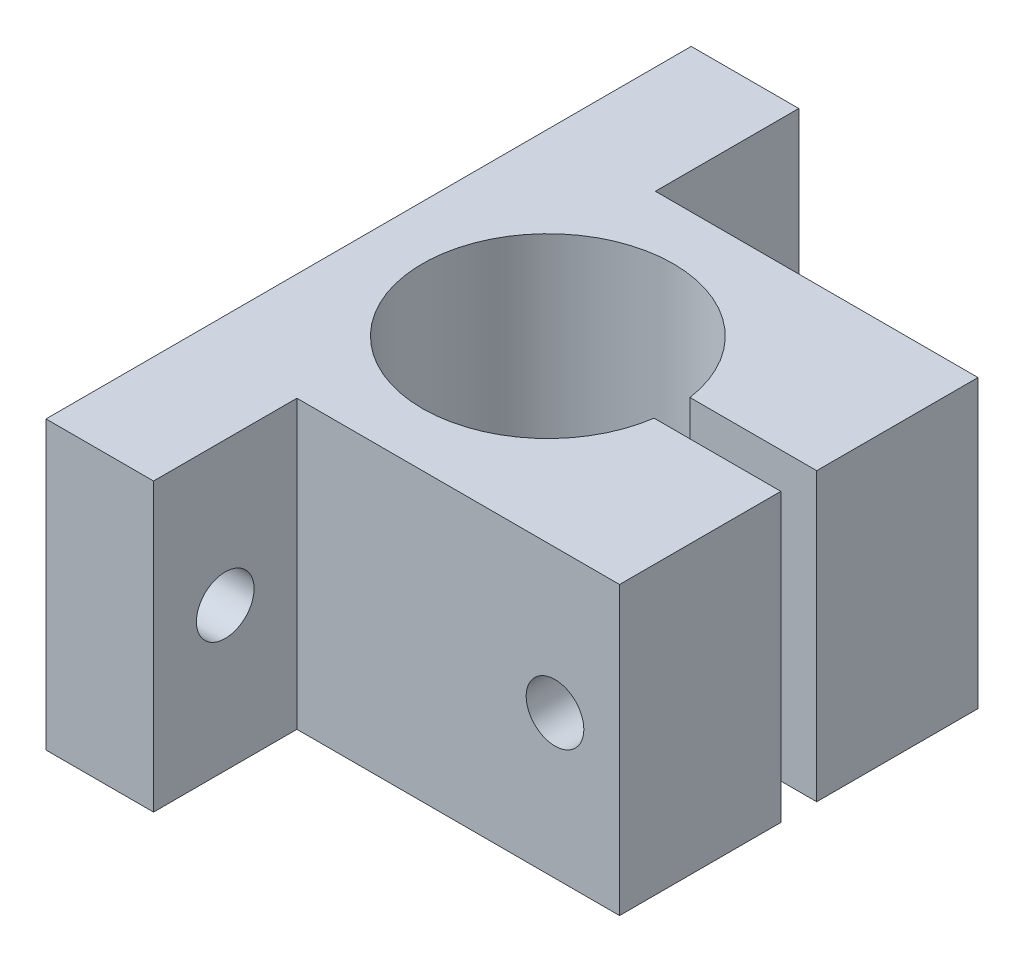
ISO-10303-21;
HEADER;
FILE_DESCRIPTION(('STEP AP214'),'2;1');
FILE_NAME('part.step','',(''),(''),'','','');
FILE_SCHEMA(('AUTOMOTIVE_DESIGN { 1 0 10303 214 1 1 1 1 }'));
ENDSEC;
DATA;
#1=APPLICATION_CONTEXT('core data for automotive mechanical design processes');
#2=APPLICATION_PROTOCOL_DEFINITION('international standard','automotive_design',2000,#1);
#3=PRODUCT_CONTEXT('',#1,'mechanical');
#4=PRODUCT('Part','Part','',(#3));
#5=PRODUCT_RELATED_PRODUCT_CATEGORY('part','',(#4));
#6=PRODUCT_DEFINITION_FORMATION('','',#4);
#7=PRODUCT_DEFINITION_CONTEXT('part definition',#1,'design');
#8=PRODUCT_DEFINITION('design','',#6,#7);
#9=PRODUCT_DEFINITION_SHAPE('','',#8);
#10=(LENGTH_UNIT() NAMED_UNIT(*) SI_UNIT(.MILLI.,.METRE.));
#11=(NAMED_UNIT(*) PLANE_ANGLE_UNIT() SI_UNIT($,.RADIAN.));
#12=(NAMED_UNIT(*) SI_UNIT($,.STERADIAN.) SOLID_ANGLE_UNIT());
#13=UNCERTAINTY_MEASURE_WITH_UNIT(LENGTH_MEASURE(1.E-05),#10,'distance_accuracy_value','');
#14=(GEOMETRIC_REPRESENTATION_CONTEXT(3) GLOBAL_UNCERTAINTY_ASSIGNED_CONTEXT((#13)) GLOBAL_UNIT_ASSIGNED_CONTEXT((#10,
#11,#12)) REPRESENTATION_CONTEXT('',''));
#15=CARTESIAN_POINT('',(0.,0.,0.));
#16=DIRECTION('',(0.,0.,1.));
#17=DIRECTION('',(1.,0.,0.));
#18=AXIS2_PLACEMENT_3D('',#15,#16,#17);
#19=CARTESIAN_POINT('',(12.7,-12.7,-28.575));
#20=DIRECTION('',(-1.,0.,0.));
#21=DIRECTION('',(0.,0.,1.));
#22=AXIS2_PLACEMENT_3D('',#19,#20,#21);
#23=PLANE('',#22);
#24=DIRECTION('',(0.,0.,1.));
#25=VECTOR('',#24,1.);
#26=CARTESIAN_POINT('',(12.7,-12.7,-28.575));
#27=LINE('',#26,#25);
#28=CARTESIAN_POINT('',(12.7,-12.7,1.5875));
#29=VERTEX_POINT('',#28);
#30=CARTESIAN_POINT('',(12.7,-12.7,15.875));
#31=VERTEX_POINT('',#30);
#32=EDGE_CURVE('E144',#29,#31,#27,.T.);
#33=ORIENTED_EDGE('',*,*,#32,.F.);
#34=DIRECTION('',(0.,1.,0.));
#35=VECTOR('',#34,1.);
#36=CARTESIAN_POINT('',(12.7,-12.7,1.5875));
#37=LINE('',#36,#35);
#38=CARTESIAN_POINT('',(12.7,12.7,1.5875));
#39=VERTEX_POINT('',#38);
#40=EDGE_CURVE('E11',#29,#39,#37,.T.);
#41=ORIENTED_EDGE('',*,*,#40,.T.);
#42=DIRECTION('',(0.,0.,1.));
#43=VECTOR('',#42,1.);
#44=CARTESIAN_POINT('',(12.7,12.7,-28.575));
#45=LINE('',#44,#43);
#46=CARTESIAN_POINT('',(12.7,12.7,15.875));
#47=VERTEX_POINT('',#46);
#48=EDGE_CURVE('E145',#39,#47,#45,.T.);
#49=ORIENTED_EDGE('',*,*,#48,.T.);
#50=DIRECTION('',(0.,1.,0.));
#51=VECTOR('',#50,1.);
#52=CARTESIAN_POINT('',(12.7,-12.7,15.875));
#53=LINE('',#52,#51);
#54=EDGE_CURVE('E218',#31,#47,#53,.T.);
#55=ORIENTED_EDGE('',*,*,#54,.F.);
#56=EDGE_LOOP('',(#33,#41,#49,#55));
#57=FACE_BOUND('',#56,.T.);
#58=ADVANCED_FACE('F35',(#57),#23,.F.);
#59=CARTESIAN_POINT('',(-25.4,12.7,-28.575));
#60=DIRECTION('',(0.,0.,1.));
#61=DIRECTION('',(1.,0.,0.));
#62=AXIS2_PLACEMENT_3D('',#59,#60,#61);
#63=PLANE('',#62);
#64=DIRECTION('',(-1.,0.,0.));
#65=VECTOR('',#64,1.);
#66=CARTESIAN_POINT('',(-25.4,12.7,-28.575));
#67=LINE('',#66,#65);
#68=CARTESIAN_POINT('',(-15.875,12.7,-28.575));
#69=VERTEX_POINT('',#68);
#70=CARTESIAN_POINT('',(-25.4,12.7,-28.575));
#71=VERTEX_POINT('',#70);
#72=EDGE_CURVE('E156',#69,#71,#67,.T.);
#73=ORIENTED_EDGE('',*,*,#72,.F.);
#74=DIRECTION('',(0.,1.,0.));
#75=VECTOR('',#74,1.);
#76=CARTESIAN_POINT('',(-15.875,-12.7,-28.575));
#77=LINE('',#76,#75);
#78=CARTESIAN_POINT('',(-15.875,-12.7,-28.575));
#79=VERTEX_POINT('',#78);
#80=EDGE_CURVE('E202',#79,#69,#77,.T.);
#81=ORIENTED_EDGE('',*,*,#80,.F.);
#82=DIRECTION('',(-1.,0.,0.));
#83=VECTOR('',#82,1.);
#84=CARTESIAN_POINT('',(-25.4,-12.7,-28.575));
#85=LINE('',#84,#83);
#86=CARTESIAN_POINT('',(-25.4,-12.7,-28.575));
#87=VERTEX_POINT('',#86);
#88=EDGE_CURVE('E154',#79,#87,#85,.T.);
#89=ORIENTED_EDGE('',*,*,#88,.T.);
#90=DIRECTION('',(0.,-1.,0.));
#91=VECTOR('',#90,1.);
#92=CARTESIAN_POINT('',(-25.4,12.7,-28.575));
#93=LINE('',#92,#91);
#94=EDGE_CURVE('E129',#71,#87,#93,.T.);
#95=ORIENTED_EDGE('',*,*,#94,.F.);
#96=EDGE_LOOP('',(#73,#81,#89,#95));
#97=FACE_BOUND('',#96,.T.);
#98=ADVANCED_FACE('F37',(#97),#63,.F.);
#99=CARTESIAN_POINT('',(-25.4,12.7,-28.575));
#100=DIRECTION('',(1.,0.,0.));
#101=DIRECTION('',(0.,0.,-1.));
#102=AXIS2_PLACEMENT_3D('',#99,#100,#101);
#103=PLANE('',#102);
#104=CARTESIAN_POINT('',(-25.4,0.,-22.225));
#105=DIRECTION('',(1.,0.,0.));
#106=DIRECTION('',(0.,0.,-1.));
#107=AXIS2_PLACEMENT_3D('',#104,#105,#106);
#108=CIRCLE('',#107,2.55269999999999);
#109=CARTESIAN_POINT('',(-25.4,0.,-24.7777));
#110=VERTEX_POINT('',#109);
#111=EDGE_CURVE('E235',#110,#110,#108,.T.);
#112=ORIENTED_EDGE('',*,*,#111,.T.);
#113=EDGE_LOOP('',(#112));
#114=FACE_BOUND('',#113,.T.);
#115=CARTESIAN_POINT('',(-25.4,0.,22.225));
#116=DIRECTION('',(1.,0.,0.));
#117=DIRECTION('',(0.,0.,-1.));
#118=AXIS2_PLACEMENT_3D('',#115,#116,#117);
#119=CIRCLE('',#118,2.55269999999999);
#120=CARTESIAN_POINT('',(-25.4,0.,19.6723));
#121=VERTEX_POINT('',#120);
#122=EDGE_CURVE('E227',#121,#121,#119,.T.);
#123=ORIENTED_EDGE('',*,*,#122,.T.);
#124=EDGE_LOOP('',(#123));
#125=FACE_BOUND('',#124,.T.);
#126=DIRECTION('',(0.,0.,1.));
#127=VECTOR('',#126,1.);
#128=CARTESIAN_POINT('',(-25.4,-12.7,-28.575));
#129=LINE('',#128,#127);
#130=CARTESIAN_POINT('',(-25.4,-12.7,28.575));
#131=VERTEX_POINT('',#130);
#132=EDGE_CURVE('E166',#87,#131,#129,.T.);
#133=ORIENTED_EDGE('',*,*,#132,.T.);
#134=DIRECTION('',(0.,-1.,0.));
#135=VECTOR('',#134,1.);
#136=CARTESIAN_POINT('',(-25.4,12.7,28.575));
#137=LINE('',#136,#135);
#138=CARTESIAN_POINT('',(-25.4,12.7,28.575));
#139=VERTEX_POINT('',#138);
#140=EDGE_CURVE('E164',#139,#131,#137,.T.);
#141=ORIENTED_EDGE('',*,*,#140,.F.);
#142=DIRECTION('',(0.,0.,1.));
#143=VECTOR('',#142,1.);
#144=CARTESIAN_POINT('',(-25.4,12.7,-28.575));
#145=LINE('',#144,#143);
#146=EDGE_CURVE('E158',#71,#139,#145,.T.);
#147=ORIENTED_EDGE('',*,*,#146,.F.);
#148=ORIENTED_EDGE('',*,*,#94,.T.);
#149=EDGE_LOOP('',(#133,#141,#147,#148));
#150=FACE_BOUND('',#149,.T.);
#151=ADVANCED_FACE('F177',(#114,#125,#150),#103,.F.);
#152=CARTESIAN_POINT('',(-25.4,12.7,28.575));
#153=DIRECTION('',(0.,0.,-1.));
#154=DIRECTION('',(-1.,0.,0.));
#155=AXIS2_PLACEMENT_3D('',#152,#153,#154);
#156=PLANE('',#155);
#157=DIRECTION('',(1.,0.,0.));
#158=VECTOR('',#157,1.);
#159=CARTESIAN_POINT('',(-25.4,-12.7,28.575));
#160=LINE('',#159,#158);
#161=CARTESIAN_POINT('',(-15.875,-12.7,28.575));
#162=VERTEX_POINT('',#161);
#163=EDGE_CURVE('E159',#131,#162,#160,.T.);
#164=ORIENTED_EDGE('',*,*,#163,.T.);
#165=DIRECTION('',(0.,1.,0.));
#166=VECTOR('',#165,1.);
#167=CARTESIAN_POINT('',(-15.875,-12.7,28.575));
#168=LINE('',#167,#166);
#169=CARTESIAN_POINT('',(-15.875,12.7,28.575));
#170=VERTEX_POINT('',#169);
#171=EDGE_CURVE('E194',#162,#170,#168,.T.);
#172=ORIENTED_EDGE('',*,*,#171,.T.);
#173=DIRECTION('',(1.,0.,0.));
#174=VECTOR('',#173,1.);
#175=CARTESIAN_POINT('',(-25.4,12.7,28.575));
#176=LINE('',#175,#174);
#177=EDGE_CURVE('E161',#139,#170,#176,.T.);
#178=ORIENTED_EDGE('',*,*,#177,.F.);
#179=ORIENTED_EDGE('',*,*,#140,.T.);
#180=EDGE_LOOP('',(#164,#172,#178,#179));
#181=FACE_BOUND('',#180,.T.);
#182=ADVANCED_FACE('F192',(#181),#156,.F.);
#183=CARTESIAN_POINT('',(0.,12.7,0.));
#184=DIRECTION('',(0.,1.,0.));
#185=DIRECTION('',(0.,0.,1.));
#186=AXIS2_PLACEMENT_3D('',#183,#184,#185);
#187=PLANE('',#186);
#188=DIRECTION('',(1.,0.,0.));
#189=VECTOR('',#188,1.);
#190=CARTESIAN_POINT('',(0.,12.7,1.5875));
#191=LINE('',#190,#189);
#192=CARTESIAN_POINT('',(1.47352262806235,12.7,1.5875));
#193=VERTEX_POINT('',#192);
#194=EDGE_CURVE('E59',#193,#39,#191,.T.);
#195=ORIENTED_EDGE('',*,*,#194,.F.);
#196=CARTESIAN_POINT('',(-9.52500000000002,12.7,0.));
#197=DIRECTION('',(0.,1.,0.));
#198=DIRECTION('',(0.,0.,1.));
#199=AXIS2_PLACEMENT_3D('',#196,#197,#198);
#200=CIRCLE('',#199,11.1125);
#201=CARTESIAN_POINT('',(1.47352262806235,12.7,-1.5875));
#202=VERTEX_POINT('',#201);
#203=EDGE_CURVE('E138',#202,#193,#200,.T.);
#204=ORIENTED_EDGE('',*,*,#203,.F.);
#205=DIRECTION('',(-1.,0.,0.));
#206=VECTOR('',#205,1.);
#207=CARTESIAN_POINT('',(0.,12.7,-1.5875));
#208=LINE('',#207,#206);
#209=CARTESIAN_POINT('',(12.7,12.7,-1.5875));
#210=VERTEX_POINT('',#209);
#211=EDGE_CURVE('E123',#210,#202,#208,.T.);
#212=ORIENTED_EDGE('',*,*,#211,.F.);
#213=CARTESIAN_POINT('',(12.7,12.7,-15.875));
#214=VERTEX_POINT('',#213);
#215=EDGE_CURVE('E136',#214,#210,#45,.T.);
#216=ORIENTED_EDGE('',*,*,#215,.F.);
#217=DIRECTION('',(1.,0.,0.));
#218=VECTOR('',#217,1.);
#219=CARTESIAN_POINT('',(12.7,12.7,-15.875));
#220=LINE('',#219,#218);
#221=CARTESIAN_POINT('',(-15.875,12.7,-15.875));
#222=VERTEX_POINT('',#221);
#223=EDGE_CURVE('E212',#222,#214,#220,.T.);
#224=ORIENTED_EDGE('',*,*,#223,.F.);
#225=DIRECTION('',(0.,0.,1.));
#226=VECTOR('',#225,1.);
#227=CARTESIAN_POINT('',(-15.875,12.7,-28.575));
#228=LINE('',#227,#226);
#229=EDGE_CURVE('E200',#69,#222,#228,.T.);
#230=ORIENTED_EDGE('',*,*,#229,.F.);
#231=ORIENTED_EDGE('',*,*,#72,.T.);
#232=ORIENTED_EDGE('',*,*,#146,.T.);
#233=ORIENTED_EDGE('',*,*,#177,.T.);
#234=DIRECTION('',(0.,0.,1.));
#235=VECTOR('',#234,1.);
#236=CARTESIAN_POINT('',(-15.875,12.7,28.575));
#237=LINE('',#236,#235);
#238=CARTESIAN_POINT('',(-15.875,12.7,15.875));
#239=VERTEX_POINT('',#238);
#240=EDGE_CURVE('E197',#239,#170,#237,.T.);
#241=ORIENTED_EDGE('',*,*,#240,.F.);
#242=DIRECTION('',(-1.,0.,0.));
#243=VECTOR('',#242,1.);
#244=CARTESIAN_POINT('',(-15.875,12.7,15.875));
#245=LINE('',#244,#243);
#246=EDGE_CURVE('E223',#47,#239,#245,.T.);
#247=ORIENTED_EDGE('',*,*,#246,.F.);
#248=ORIENTED_EDGE('',*,*,#48,.F.);
#249=EDGE_LOOP('',(#195,#204,#212,#216,#224,#230,#231,#232,#233,#241,#247,#248));
#250=FACE_BOUND('',#249,.T.);
#251=ADVANCED_FACE('F134',(#250),#187,.T.);
#252=CARTESIAN_POINT('',(0.,-12.7,0.));
#253=DIRECTION('',(0.,1.,0.));
#254=DIRECTION('',(0.,0.,1.));
#255=AXIS2_PLACEMENT_3D('',#252,#253,#254);
#256=PLANE('',#255);
#257=CARTESIAN_POINT('',(-9.52500000000002,-12.7,0.));
#258=DIRECTION('',(0.,1.,0.));
#259=DIRECTION('',(0.,0.,1.));
#260=AXIS2_PLACEMENT_3D('',#257,#258,#259);
#261=CIRCLE('',#260,11.1125);
#262=CARTESIAN_POINT('',(1.47352262806235,-12.7,-1.5875));
#263=VERTEX_POINT('',#262);
#264=CARTESIAN_POINT('',(1.47352262806235,-12.7,1.5875));
#265=VERTEX_POINT('',#264);
#266=EDGE_CURVE('E151',#263,#265,#261,.T.);
#267=ORIENTED_EDGE('',*,*,#266,.T.);
#268=DIRECTION('',(1.,0.,0.));
#269=VECTOR('',#268,1.);
#270=CARTESIAN_POINT('',(0.,-12.7,1.5875));
#271=LINE('',#270,#269);
#272=EDGE_CURVE('E242',#265,#29,#271,.T.);
#273=ORIENTED_EDGE('',*,*,#272,.T.);
#274=ORIENTED_EDGE('',*,*,#32,.T.);
#275=DIRECTION('',(-1.,0.,0.));
#276=VECTOR('',#275,1.);
#277=CARTESIAN_POINT('',(-15.875,-12.7,15.875));
#278=LINE('',#277,#276);
#279=CARTESIAN_POINT('',(-15.875,-12.7,15.875));
#280=VERTEX_POINT('',#279);
#281=EDGE_CURVE('E219',#31,#280,#278,.T.);
#282=ORIENTED_EDGE('',*,*,#281,.T.);
#283=DIRECTION('',(0.,0.,1.));
#284=VECTOR('',#283,1.);
#285=CARTESIAN_POINT('',(-15.875,-12.7,28.575));
#286=LINE('',#285,#284);
#287=EDGE_CURVE('E189',#280,#162,#286,.T.);
#288=ORIENTED_EDGE('',*,*,#287,.T.);
#289=ORIENTED_EDGE('',*,*,#163,.F.);
#290=ORIENTED_EDGE('',*,*,#132,.F.);
#291=ORIENTED_EDGE('',*,*,#88,.F.);
#292=DIRECTION('',(0.,0.,1.));
#293=VECTOR('',#292,1.);
#294=CARTESIAN_POINT('',(-15.875,-12.7,-28.575));
#295=LINE('',#294,#293);
#296=CARTESIAN_POINT('',(-15.875,-12.7,-15.875));
#297=VERTEX_POINT('',#296);
#298=EDGE_CURVE('E208',#79,#297,#295,.T.);
#299=ORIENTED_EDGE('',*,*,#298,.T.);
#300=DIRECTION('',(1.,0.,0.));
#301=VECTOR('',#300,1.);
#302=CARTESIAN_POINT('',(12.7,-12.7,-15.875));
#303=LINE('',#302,#301);
#304=CARTESIAN_POINT('',(12.7,-12.7,-15.875));
#305=VERTEX_POINT('',#304);
#306=EDGE_CURVE('E205',#297,#305,#303,.T.);
#307=ORIENTED_EDGE('',*,*,#306,.T.);
#308=CARTESIAN_POINT('',(12.7,-12.7,-1.5875));
#309=VERTEX_POINT('',#308);
#310=EDGE_CURVE('E147',#305,#309,#27,.T.);
#311=ORIENTED_EDGE('',*,*,#310,.T.);
#312=DIRECTION('',(-1.,0.,0.));
#313=VECTOR('',#312,1.);
#314=CARTESIAN_POINT('',(0.,-12.7,-1.5875));
#315=LINE('',#314,#313);
#316=EDGE_CURVE('E51',#309,#263,#315,.T.);
#317=ORIENTED_EDGE('',*,*,#316,.T.);
#318=EDGE_LOOP('',(#267,#273,#274,#282,#288,#289,#290,#291,#299,#307,#311,#317));
#319=FACE_BOUND('',#318,.T.);
#320=ADVANCED_FACE('F184',(#319),#256,.F.);
#321=CARTESIAN_POINT('',(-9.52500000000002,-12.7,0.));
#322=DIRECTION('',(0.,1.,0.));
#323=DIRECTION('',(0.,0.,1.));
#324=AXIS2_PLACEMENT_3D('',#321,#322,#323);
#325=CYLINDRICAL_SURFACE('',#324,11.1125);
#326=ORIENTED_EDGE('',*,*,#203,.T.);
#327=DIRECTION('',(0.,1.,0.));
#328=VECTOR('',#327,1.);
#329=CARTESIAN_POINT('',(1.47352262806235,-12.7,1.5875));
#330=LINE('',#329,#328);
#331=EDGE_CURVE('E139',#193,#265,#330,.F.);
#332=ORIENTED_EDGE('',*,*,#331,.T.);
#333=ORIENTED_EDGE('',*,*,#266,.F.);
#334=DIRECTION('',(0.,1.,0.));
#335=VECTOR('',#334,1.);
#336=CARTESIAN_POINT('',(1.47352262806235,-12.7,-1.5875));
#337=LINE('',#336,#335);
#338=EDGE_CURVE('E248',#263,#202,#337,.T.);
#339=ORIENTED_EDGE('',*,*,#338,.T.);
#340=EDGE_LOOP('',(#326,#332,#333,#339));
#341=FACE_BOUND('',#340,.T.);
#342=ADVANCED_FACE('F296',(#341),#325,.F.);
#343=ORIENTED_EDGE('',*,*,#215,.T.);
#344=DIRECTION('',(0.,-1.,0.));
#345=VECTOR('',#344,1.);
#346=CARTESIAN_POINT('',(12.7,-12.7,-1.5875));
#347=LINE('',#346,#345);
#348=EDGE_CURVE('E44',#210,#309,#347,.T.);
#349=ORIENTED_EDGE('',*,*,#348,.T.);
#350=ORIENTED_EDGE('',*,*,#310,.F.);
#351=DIRECTION('',(0.,1.,0.));
#352=VECTOR('',#351,1.);
#353=CARTESIAN_POINT('',(12.7,-12.7,-15.875));
#354=LINE('',#353,#352);
#355=EDGE_CURVE('E143',#305,#214,#354,.T.);
#356=ORIENTED_EDGE('',*,*,#355,.T.);
#357=EDGE_LOOP('',(#343,#349,#350,#356));
#358=FACE_BOUND('',#357,.T.);
#359=ADVANCED_FACE('F142',(#358),#23,.F.);
#360=CARTESIAN_POINT('',(12.7,-12.7,-15.875));
#361=DIRECTION('',(0.,0.,1.));
#362=DIRECTION('',(1.,0.,0.));
#363=AXIS2_PLACEMENT_3D('',#360,#361,#362);
#364=PLANE('',#363);
#365=CARTESIAN_POINT('',(6.98499999999999,0.,-15.875));
#366=DIRECTION('',(0.,0.,1.));
#367=DIRECTION('',(1.,0.,0.));
#368=AXIS2_PLACEMENT_3D('',#365,#366,#367);
#369=CIRCLE('',#368,2.55269999999999);
#370=CARTESIAN_POINT('',(9.53769999999998,0.,-15.875));
#371=VERTEX_POINT('',#370);
#372=EDGE_CURVE('E39',#371,#371,#369,.T.);
#373=ORIENTED_EDGE('',*,*,#372,.T.);
#374=EDGE_LOOP('',(#373));
#375=FACE_BOUND('',#374,.T.);
#376=ORIENTED_EDGE('',*,*,#223,.T.);
#377=ORIENTED_EDGE('',*,*,#355,.F.);
#378=ORIENTED_EDGE('',*,*,#306,.F.);
#379=DIRECTION('',(0.,1.,0.));
#380=VECTOR('',#379,1.);
#381=CARTESIAN_POINT('',(-15.875,-12.7,-15.875));
#382=LINE('',#381,#380);
#383=EDGE_CURVE('E204',#297,#222,#382,.T.);
#384=ORIENTED_EDGE('',*,*,#383,.T.);
#385=EDGE_LOOP('',(#376,#377,#378,#384));
#386=FACE_BOUND('',#385,.T.);
#387=ADVANCED_FACE('F263',(#375,#386),#364,.F.);
#388=CARTESIAN_POINT('',(-15.875,-12.7,-28.575));
#389=DIRECTION('',(-1.,0.,0.));
#390=DIRECTION('',(0.,0.,1.));
#391=AXIS2_PLACEMENT_3D('',#388,#389,#390);
#392=PLANE('',#391);
#393=CARTESIAN_POINT('',(-15.875,0.,-22.225));
#394=DIRECTION('',(1.,0.,0.));
#395=DIRECTION('',(0.,0.,-1.));
#396=AXIS2_PLACEMENT_3D('',#393,#394,#395);
#397=CIRCLE('',#396,2.55269999999999);
#398=CARTESIAN_POINT('',(-15.875,0.,-24.7777));
#399=VERTEX_POINT('',#398);
#400=EDGE_CURVE('E238',#399,#399,#397,.T.);
#401=ORIENTED_EDGE('',*,*,#400,.F.);
#402=EDGE_LOOP('',(#401));
#403=FACE_BOUND('',#402,.T.);
#404=ORIENTED_EDGE('',*,*,#229,.T.);
#405=ORIENTED_EDGE('',*,*,#383,.F.);
#406=ORIENTED_EDGE('',*,*,#298,.F.);
#407=ORIENTED_EDGE('',*,*,#80,.T.);
#408=EDGE_LOOP('',(#404,#405,#406,#407));
#409=FACE_BOUND('',#408,.T.);
#410=ADVANCED_FACE('F301',(#403,#409),#392,.F.);
#411=CARTESIAN_POINT('',(-15.875,-12.7,28.575));
#412=DIRECTION('',(-1.,0.,0.));
#413=DIRECTION('',(0.,0.,1.));
#414=AXIS2_PLACEMENT_3D('',#411,#412,#413);
#415=PLANE('',#414);
#416=CARTESIAN_POINT('',(-15.875,0.,22.225));
#417=DIRECTION('',(1.,0.,0.));
#418=DIRECTION('',(0.,0.,-1.));
#419=AXIS2_PLACEMENT_3D('',#416,#417,#418);
#420=CIRCLE('',#419,2.55269999999999);
#421=CARTESIAN_POINT('',(-15.875,0.,19.6723));
#422=VERTEX_POINT('',#421);
#423=EDGE_CURVE('E232',#422,#422,#420,.T.);
#424=ORIENTED_EDGE('',*,*,#423,.F.);
#425=EDGE_LOOP('',(#424));
#426=FACE_BOUND('',#425,.T.);
#427=ORIENTED_EDGE('',*,*,#240,.T.);
#428=ORIENTED_EDGE('',*,*,#171,.F.);
#429=ORIENTED_EDGE('',*,*,#287,.F.);
#430=DIRECTION('',(0.,1.,0.));
#431=VECTOR('',#430,1.);
#432=CARTESIAN_POINT('',(-15.875,-12.7,15.875));
#433=LINE('',#432,#431);
#434=EDGE_CURVE('E214',#280,#239,#433,.T.);
#435=ORIENTED_EDGE('',*,*,#434,.T.);
#436=EDGE_LOOP('',(#427,#428,#429,#435));
#437=FACE_BOUND('',#436,.T.);
#438=ADVANCED_FACE('F326',(#426,#437),#415,.F.);
#439=CARTESIAN_POINT('',(-15.875,-12.7,15.875));
#440=DIRECTION('',(0.,0.,-1.));
#441=DIRECTION('',(-1.,0.,0.));
#442=AXIS2_PLACEMENT_3D('',#439,#440,#441);
#443=PLANE('',#442);
#444=CARTESIAN_POINT('',(6.98499999999999,0.,15.875));
#445=DIRECTION('',(0.,0.,1.));
#446=DIRECTION('',(1.,0.,0.));
#447=AXIS2_PLACEMENT_3D('',#444,#445,#446);
#448=CIRCLE('',#447,2.55269999999999);
#449=CARTESIAN_POINT('',(9.53769999999998,0.,15.875));
#450=VERTEX_POINT('',#449);
#451=EDGE_CURVE('E256',#450,#450,#448,.T.);
#452=ORIENTED_EDGE('',*,*,#451,.F.);
#453=EDGE_LOOP('',(#452));
#454=FACE_BOUND('',#453,.T.);
#455=ORIENTED_EDGE('',*,*,#246,.T.);
#456=ORIENTED_EDGE('',*,*,#434,.F.);
#457=ORIENTED_EDGE('',*,*,#281,.F.);
#458=ORIENTED_EDGE('',*,*,#54,.T.);
#459=EDGE_LOOP('',(#455,#456,#457,#458));
#460=FACE_BOUND('',#459,.T.);
#461=ADVANCED_FACE('F322',(#454,#460),#443,.F.);
#462=CARTESIAN_POINT('',(-15.875,0.,22.225));
#463=DIRECTION('',(1.,0.,0.));
#464=DIRECTION('',(0.,0.,-1.));
#465=AXIS2_PLACEMENT_3D('',#462,#463,#464);
#466=CYLINDRICAL_SURFACE('',#465,2.55269999999999);
#467=ORIENTED_EDGE('',*,*,#122,.F.);
#468=EDGE_LOOP('',(#467));
#469=FACE_BOUND('',#468,.T.);
#470=ORIENTED_EDGE('',*,*,#423,.T.);
#471=EDGE_LOOP('',(#470));
#472=FACE_BOUND('',#471,.T.);
#473=ADVANCED_FACE('F283',(#469,#472),#466,.F.);
#474=CARTESIAN_POINT('',(-15.875,0.,-22.225));
#475=DIRECTION('',(1.,0.,0.));
#476=DIRECTION('',(0.,0.,-1.));
#477=AXIS2_PLACEMENT_3D('',#474,#475,#476);
#478=CYLINDRICAL_SURFACE('',#477,2.55269999999999);
#479=ORIENTED_EDGE('',*,*,#111,.F.);
#480=EDGE_LOOP('',(#479));
#481=FACE_BOUND('',#480,.T.);
#482=ORIENTED_EDGE('',*,*,#400,.T.);
#483=EDGE_LOOP('',(#482));
#484=FACE_BOUND('',#483,.T.);
#485=ADVANCED_FACE('F275',(#481,#484),#478,.F.);
#486=CARTESIAN_POINT('',(-11.43,18.5450064262227,-1.5875));
#487=DIRECTION('',(0.,0.,-1.));
#488=DIRECTION('',(-1.,0.,0.));
#489=AXIS2_PLACEMENT_3D('',#486,#487,#488);
#490=PLANE('',#489);
#491=CARTESIAN_POINT('',(6.98499999999999,0.,-1.5875));
#492=DIRECTION('',(0.,0.,-1.));
#493=DIRECTION('',(-1.,0.,0.));
#494=AXIS2_PLACEMENT_3D('',#491,#492,#493);
#495=CIRCLE('',#494,2.55269999999999);
#496=CARTESIAN_POINT('',(4.43230000000001,0.,-1.5875));
#497=VERTEX_POINT('',#496);
#498=EDGE_CURVE('E253',#497,#497,#495,.T.);
#499=ORIENTED_EDGE('',*,*,#498,.T.);
#500=EDGE_LOOP('',(#499));
#501=FACE_BOUND('',#500,.T.);
#502=ORIENTED_EDGE('',*,*,#211,.T.);
#503=ORIENTED_EDGE('',*,*,#338,.F.);
#504=ORIENTED_EDGE('',*,*,#316,.F.);
#505=ORIENTED_EDGE('',*,*,#348,.F.);
#506=EDGE_LOOP('',(#502,#503,#504,#505));
#507=FACE_BOUND('',#506,.T.);
#508=ADVANCED_FACE('F122',(#501,#507),#490,.F.);
#509=CARTESIAN_POINT('',(-11.43,18.5450064262227,1.5875));
#510=DIRECTION('',(0.,0.,1.));
#511=DIRECTION('',(1.,0.,0.));
#512=AXIS2_PLACEMENT_3D('',#509,#510,#511);
#513=PLANE('',#512);
#514=CARTESIAN_POINT('',(6.98499999999999,0.,1.5875));
#515=DIRECTION('',(0.,0.,1.));
#516=DIRECTION('',(1.,0.,0.));
#517=AXIS2_PLACEMENT_3D('',#514,#515,#516);
#518=CIRCLE('',#517,2.55269999999999);
#519=CARTESIAN_POINT('',(9.53769999999998,0.,1.5875));
#520=VERTEX_POINT('',#519);
#521=EDGE_CURVE('E250',#520,#520,#518,.T.);
#522=ORIENTED_EDGE('',*,*,#521,.T.);
#523=EDGE_LOOP('',(#522));
#524=FACE_BOUND('',#523,.T.);
#525=ORIENTED_EDGE('',*,*,#194,.T.);
#526=ORIENTED_EDGE('',*,*,#40,.F.);
#527=ORIENTED_EDGE('',*,*,#272,.F.);
#528=ORIENTED_EDGE('',*,*,#331,.F.);
#529=EDGE_LOOP('',(#525,#526,#527,#528));
#530=FACE_BOUND('',#529,.T.);
#531=ADVANCED_FACE('F270',(#524,#530),#513,.F.);
#532=CARTESIAN_POINT('',(6.98499999999999,0.,15.875));
#533=DIRECTION('',(0.,0.,1.));
#534=DIRECTION('',(1.,0.,0.));
#535=AXIS2_PLACEMENT_3D('',#532,#533,#534);
#536=CYLINDRICAL_SURFACE('',#535,2.55269999999999);
#537=ORIENTED_EDGE('',*,*,#372,.F.);
#538=EDGE_LOOP('',(#537));
#539=FACE_BOUND('',#538,.T.);
#540=ORIENTED_EDGE('',*,*,#498,.F.);
#541=EDGE_LOOP('',(#540));
#542=FACE_BOUND('',#541,.T.);
#543=ADVANCED_FACE('F266',(#539,#542),#536,.F.);
#544=ORIENTED_EDGE('',*,*,#451,.T.);
#545=EDGE_LOOP('',(#544));
#546=FACE_BOUND('',#545,.T.);
#547=ORIENTED_EDGE('',*,*,#521,.F.);
#548=EDGE_LOOP('',(#547));
#549=FACE_BOUND('',#548,.T.);
#550=ADVANCED_FACE('F269',(#546,#549),#536,.F.);
#551=CLOSED_SHELL('',(#58,#98,#151,#182,#251,#320,#342,#359,#387,#410,#438,#461,#473,#485,#508,
#531,#543,#550));
#552=MANIFOLD_SOLID_BREP('B2',#551);
#553=ADVANCED_BREP_SHAPE_REPRESENTATION('',(#18,#552),#14);
#554=SHAPE_DEFINITION_REPRESENTATION(#9,#553);
ENDSEC;
END-ISO-10303-21;
